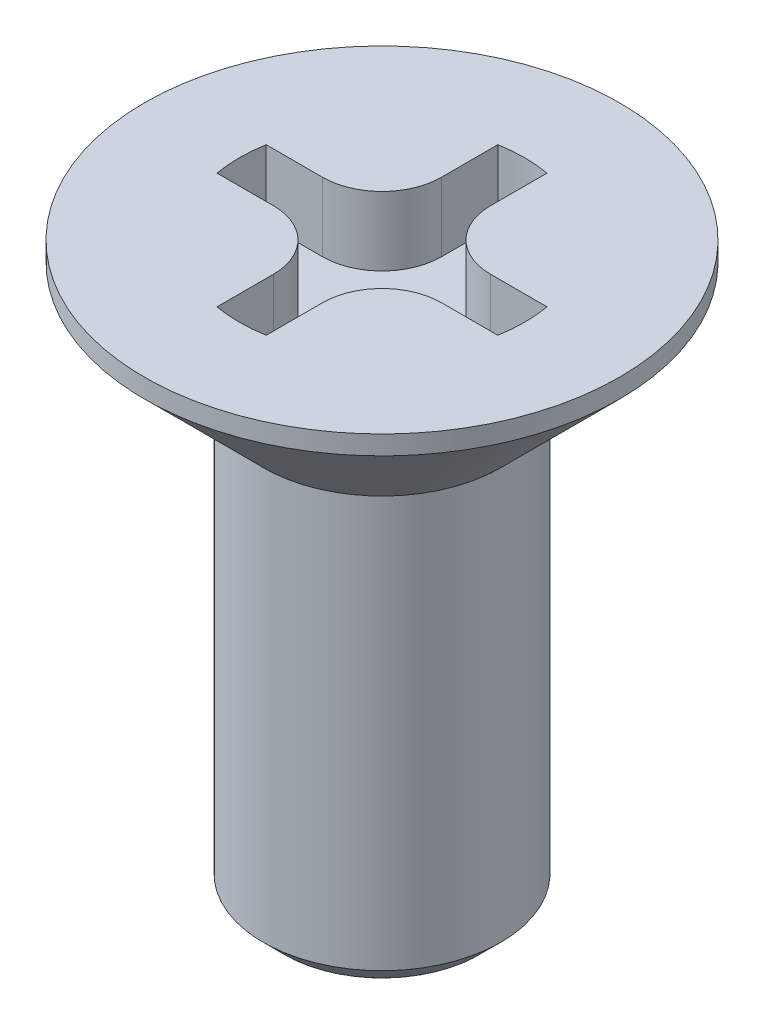
ISO-10303-21;
HEADER;
FILE_DESCRIPTION(('STEP AP214'),'2;1');
FILE_NAME('part.step','',(''),(''),'','','');
FILE_SCHEMA(('AUTOMOTIVE_DESIGN { 1 0 10303 214 1 1 1 1 }'));
ENDSEC;
DATA;
#1=APPLICATION_CONTEXT('core data for automotive mechanical design processes');
#2=APPLICATION_PROTOCOL_DEFINITION('international standard','automotive_design',2000,#1);
#3=PRODUCT_CONTEXT('',#1,'mechanical');
#4=PRODUCT('Part','Part','',(#3));
#5=PRODUCT_RELATED_PRODUCT_CATEGORY('part','',(#4));
#6=PRODUCT_DEFINITION_FORMATION('','',#4);
#7=PRODUCT_DEFINITION_CONTEXT('part definition',#1,'design');
#8=PRODUCT_DEFINITION('design','',#6,#7);
#9=PRODUCT_DEFINITION_SHAPE('','',#8);
#10=(LENGTH_UNIT() NAMED_UNIT(*) SI_UNIT(.MILLI.,.METRE.));
#11=(NAMED_UNIT(*) PLANE_ANGLE_UNIT() SI_UNIT($,.RADIAN.));
#12=(NAMED_UNIT(*) SI_UNIT($,.STERADIAN.) SOLID_ANGLE_UNIT());
#13=UNCERTAINTY_MEASURE_WITH_UNIT(LENGTH_MEASURE(1.E-05),#10,'distance_accuracy_value','');
#14=(GEOMETRIC_REPRESENTATION_CONTEXT(3) GLOBAL_UNCERTAINTY_ASSIGNED_CONTEXT((#13)) GLOBAL_UNIT_ASSIGNED_CONTEXT((#10,
#11,#12)) REPRESENTATION_CONTEXT('',''));
#15=CARTESIAN_POINT('',(0.,0.,0.));
#16=DIRECTION('',(0.,0.,1.));
#17=DIRECTION('',(1.,0.,0.));
#18=AXIS2_PLACEMENT_3D('',#15,#16,#17);
#19=CARTESIAN_POINT('',(0.,0.725,0.));
#20=DIRECTION('',(0.,-1.,0.));
#21=DIRECTION('',(0.,0.,-1.));
#22=AXIS2_PLACEMENT_3D('',#19,#20,#21);
#23=PLANE('',#22);
#24=CARTESIAN_POINT('',(-0.8838834764832,0.725,0.8838834764832));
#25=DIRECTION('',(0.,1.,0.));
#26=DIRECTION('',(1.,0.,0.));
#27=AXIS2_PLACEMENT_3D('',#24,#25,#26);
#28=CIRCLE('',#27,0.625);
#29=CARTESIAN_POINT('',(-0.2588834764832,0.725,0.8838834764832));
#30=VERTEX_POINT('',#29);
#31=CARTESIAN_POINT('',(-0.8838834764832,0.725,0.2588834764832));
#32=VERTEX_POINT('',#31);
#33=EDGE_CURVE('P0_E11',#30,#32,#28,.T.);
#34=ORIENTED_EDGE('',*,*,#33,.F.);
#35=DIRECTION('',(0.,0.,-1.));
#36=VECTOR('',#35,1.);
#37=CARTESIAN_POINT('',(-0.2588834764832,0.725,1.477490895269));
#38=LINE('',#37,#36);
#39=CARTESIAN_POINT('',(-0.2588834764832,0.725,1.477490895269));
#40=VERTEX_POINT('',#39);
#41=EDGE_CURVE('P0_E42',#40,#30,#38,.T.);
#42=ORIENTED_EDGE('',*,*,#41,.F.);
#43=CARTESIAN_POINT('',(0.,0.725,0.));
#44=DIRECTION('',(0.,-1.,0.));
#45=DIRECTION('',(0.172588984322101,0.,0.984993930179606));
#46=AXIS2_PLACEMENT_3D('',#43,#44,#45);
#47=CIRCLE('',#46,1.5);
#48=CARTESIAN_POINT('',(0.2588834764832,0.725,1.477490895269));
#49=VERTEX_POINT('',#48);
#50=EDGE_CURVE('P0_E304',#49,#40,#47,.T.);
#51=ORIENTED_EDGE('',*,*,#50,.F.);
#52=DIRECTION('',(0.,0.,1.));
#53=VECTOR('',#52,1.);
#54=CARTESIAN_POINT('',(0.2588834764832,0.725,0.8838834764832));
#55=LINE('',#54,#53);
#56=CARTESIAN_POINT('',(0.2588834764832,0.725,0.8838834764832));
#57=VERTEX_POINT('',#56);
#58=EDGE_CURVE('P0_E303',#57,#49,#55,.T.);
#59=ORIENTED_EDGE('',*,*,#58,.F.);
#60=CARTESIAN_POINT('',(0.8838834764832,0.725,0.8838834764832));
#61=DIRECTION('',(0.,1.,0.));
#62=DIRECTION('',(0.,0.,-1.));
#63=AXIS2_PLACEMENT_3D('',#60,#61,#62);
#64=CIRCLE('',#63,0.625);
#65=CARTESIAN_POINT('',(0.8838834764832,0.725,0.2588834764832));
#66=VERTEX_POINT('',#65);
#67=EDGE_CURVE('P0_E241',#66,#57,#64,.T.);
#68=ORIENTED_EDGE('',*,*,#67,.F.);
#69=DIRECTION('',(-1.,0.,0.));
#70=VECTOR('',#69,1.);
#71=CARTESIAN_POINT('',(1.477490895269,0.725,0.2588834764832));
#72=LINE('',#71,#70);
#73=CARTESIAN_POINT('',(1.477490895269,0.725,0.2588834764832));
#74=VERTEX_POINT('',#73);
#75=EDGE_CURVE('P0_E295',#74,#66,#72,.T.);
#76=ORIENTED_EDGE('',*,*,#75,.F.);
#77=CARTESIAN_POINT('',(0.,0.725,0.));
#78=DIRECTION('',(0.,-1.,0.));
#79=DIRECTION('',(0.984993930179606,0.,-0.172588984322101));
#80=AXIS2_PLACEMENT_3D('',#77,#78,#79);
#81=CIRCLE('',#80,1.5);
#82=CARTESIAN_POINT('',(1.477490895269,0.725,-0.2588834764832));
#83=VERTEX_POINT('',#82);
#84=EDGE_CURVE('P0_E217',#83,#74,#81,.T.);
#85=ORIENTED_EDGE('',*,*,#84,.F.);
#86=DIRECTION('',(1.,0.,0.));
#87=VECTOR('',#86,1.);
#88=CARTESIAN_POINT('',(0.8838834764832,0.725,-0.2588834764832));
#89=LINE('',#88,#87);
#90=CARTESIAN_POINT('',(0.8838834764832,0.725,-0.2588834764832));
#91=VERTEX_POINT('',#90);
#92=EDGE_CURVE('P0_E218',#91,#83,#89,.T.);
#93=ORIENTED_EDGE('',*,*,#92,.F.);
#94=CARTESIAN_POINT('',(0.8838834764832,0.725,-0.8838834764832));
#95=DIRECTION('',(0.,1.,0.));
#96=DIRECTION('',(-1.,0.,0.));
#97=AXIS2_PLACEMENT_3D('',#94,#95,#96);
#98=CIRCLE('',#97,0.625);
#99=CARTESIAN_POINT('',(0.2588834764832,0.725,-0.8838834764832));
#100=VERTEX_POINT('',#99);
#101=EDGE_CURVE('P0_E266',#100,#91,#98,.T.);
#102=ORIENTED_EDGE('',*,*,#101,.F.);
#103=DIRECTION('',(0.,0.,1.));
#104=VECTOR('',#103,1.);
#105=CARTESIAN_POINT('',(0.2588834764832,0.725,-1.477490895269));
#106=LINE('',#105,#104);
#107=CARTESIAN_POINT('',(0.2588834764832,0.725,-1.477490895269));
#108=VERTEX_POINT('',#107);
#109=EDGE_CURVE('P0_E287',#108,#100,#106,.T.);
#110=ORIENTED_EDGE('',*,*,#109,.F.);
#111=CARTESIAN_POINT('',(0.,0.725,0.));
#112=DIRECTION('',(0.,-1.,0.));
#113=DIRECTION('',(-0.172588984322101,0.,-0.984993930179606));
#114=AXIS2_PLACEMENT_3D('',#111,#112,#113);
#115=CIRCLE('',#114,1.5);
#116=CARTESIAN_POINT('',(-0.2588834764832,0.725,-1.477490895269));
#117=VERTEX_POINT('',#116);
#118=EDGE_CURVE('P0_E282',#117,#108,#115,.T.);
#119=ORIENTED_EDGE('',*,*,#118,.F.);
#120=DIRECTION('',(0.,0.,-1.));
#121=VECTOR('',#120,1.);
#122=CARTESIAN_POINT('',(-0.2588834764832,0.725,-0.8838834764832));
#123=LINE('',#122,#121);
#124=CARTESIAN_POINT('',(-0.2588834764832,0.725,-0.8838834764832));
#125=VERTEX_POINT('',#124);
#126=EDGE_CURVE('P0_E283',#125,#117,#123,.T.);
#127=ORIENTED_EDGE('',*,*,#126,.F.);
#128=CARTESIAN_POINT('',(-0.8838834764832,0.725,-0.8838834764832));
#129=DIRECTION('',(0.,1.,0.));
#130=DIRECTION('',(0.,0.,1.));
#131=AXIS2_PLACEMENT_3D('',#128,#129,#130);
#132=CIRCLE('',#131,0.625);
#133=CARTESIAN_POINT('',(-0.8838834764832,0.725,-0.2588834764832));
#134=VERTEX_POINT('',#133);
#135=EDGE_CURVE('P0_E177',#134,#125,#132,.T.);
#136=ORIENTED_EDGE('',*,*,#135,.F.);
#137=DIRECTION('',(1.,0.,0.));
#138=VECTOR('',#137,1.);
#139=CARTESIAN_POINT('',(-1.477490895269,0.725,-0.2588834764832));
#140=LINE('',#139,#138);
#141=CARTESIAN_POINT('',(-1.477490895269,0.725,-0.2588834764832));
#142=VERTEX_POINT('',#141);
#143=EDGE_CURVE('P0_E173',#142,#134,#140,.T.);
#144=ORIENTED_EDGE('',*,*,#143,.F.);
#145=CARTESIAN_POINT('',(0.,0.725,0.));
#146=DIRECTION('',(0.,-1.,0.));
#147=DIRECTION('',(-0.984993930179606,0.,0.172588984322101));
#148=AXIS2_PLACEMENT_3D('',#145,#146,#147);
#149=CIRCLE('',#148,1.5);
#150=CARTESIAN_POINT('',(-1.477490895269,0.725,0.2588834764832));
#151=VERTEX_POINT('',#150);
#152=EDGE_CURVE('P0_E265',#151,#142,#149,.T.);
#153=ORIENTED_EDGE('',*,*,#152,.F.);
#154=DIRECTION('',(-1.,0.,0.));
#155=VECTOR('',#154,1.);
#156=CARTESIAN_POINT('',(-0.8838834764832,0.725,0.2588834764832));
#157=LINE('',#156,#155);
#158=EDGE_CURVE('P0_E258',#32,#151,#157,.T.);
#159=ORIENTED_EDGE('',*,*,#158,.F.);
#160=EDGE_LOOP('',(#34,#42,#51,#59,#68,#76,#85,#93,#102,#110,#119,#127,#136,#144,#153,#159));
#161=FACE_BOUND('',#160,.T.);
#162=ADVANCED_FACE('P0_F17',(#161),#23,.F.);
#163=CARTESIAN_POINT('',(-0.8838834764832,0.725,0.8838834764832));
#164=DIRECTION('',(0.,-1.,0.));
#165=DIRECTION('',(1.,0.,0.));
#166=AXIS2_PLACEMENT_3D('',#163,#164,#165);
#167=CYLINDRICAL_SURFACE('',#166,0.625);
#168=DIRECTION('',(0.,1.,0.));
#169=VECTOR('',#168,1.);
#170=CARTESIAN_POINT('',(-0.2588834764832,0.725,0.8838834764832));
#171=LINE('',#170,#169);
#172=CARTESIAN_POINT('',(-0.2588834764832,1.45,0.8838834764832));
#173=VERTEX_POINT('',#172);
#174=EDGE_CURVE('P0_E25',#30,#173,#171,.T.);
#175=ORIENTED_EDGE('',*,*,#174,.F.);
#176=ORIENTED_EDGE('',*,*,#33,.T.);
#177=DIRECTION('',(0.,1.,0.));
#178=VECTOR('',#177,1.);
#179=CARTESIAN_POINT('',(-0.8838834764832,0.725,0.2588834764832));
#180=LINE('',#179,#178);
#181=CARTESIAN_POINT('',(-0.8838834764832,1.45,0.2588834764832));
#182=VERTEX_POINT('',#181);
#183=EDGE_CURVE('P0_E255',#32,#182,#180,.T.);
#184=ORIENTED_EDGE('',*,*,#183,.T.);
#185=CARTESIAN_POINT('',(-0.8838834764832,1.45,0.8838834764832));
#186=DIRECTION('',(0.,1.,0.));
#187=DIRECTION('',(1.,0.,0.));
#188=AXIS2_PLACEMENT_3D('',#185,#186,#187);
#189=CIRCLE('',#188,0.625);
#190=EDGE_CURVE('P0_E250',#173,#182,#189,.T.);
#191=ORIENTED_EDGE('',*,*,#190,.F.);
#192=EDGE_LOOP('',(#175,#176,#184,#191));
#193=FACE_BOUND('',#192,.T.);
#194=ADVANCED_FACE('P0_F394',(#193),#167,.T.);
#195=CARTESIAN_POINT('',(-0.2588834764832,0.725,1.477490895269));
#196=DIRECTION('',(-1.,0.,0.));
#197=DIRECTION('',(0.,0.,1.));
#198=AXIS2_PLACEMENT_3D('',#195,#196,#197);
#199=PLANE('',#198);
#200=DIRECTION('',(0.,1.,0.));
#201=VECTOR('',#200,1.);
#202=CARTESIAN_POINT('',(-0.2588834764832,0.725,1.477490895269));
#203=LINE('',#202,#201);
#204=CARTESIAN_POINT('',(-0.2588834764832,1.45,1.477490895269));
#205=VERTEX_POINT('',#204);
#206=EDGE_CURVE('P0_E307',#40,#205,#203,.T.);
#207=ORIENTED_EDGE('',*,*,#206,.F.);
#208=ORIENTED_EDGE('',*,*,#41,.T.);
#209=ORIENTED_EDGE('',*,*,#174,.T.);
#210=DIRECTION('',(0.,0.,-1.));
#211=VECTOR('',#210,1.);
#212=CARTESIAN_POINT('',(-0.2588834764832,1.45,1.477490895269));
#213=LINE('',#212,#211);
#214=EDGE_CURVE('P0_E240',#205,#173,#213,.T.);
#215=ORIENTED_EDGE('',*,*,#214,.F.);
#216=EDGE_LOOP('',(#207,#208,#209,#215));
#217=FACE_BOUND('',#216,.T.);
#218=ADVANCED_FACE('P0_F396',(#217),#199,.F.);
#219=CARTESIAN_POINT('',(0.,0.725,0.));
#220=DIRECTION('',(0.,-1.,0.));
#221=DIRECTION('',(1.,0.,0.));
#222=AXIS2_PLACEMENT_3D('',#219,#220,#221);
#223=CYLINDRICAL_SURFACE('',#222,1.5);
#224=DIRECTION('',(0.,1.,0.));
#225=VECTOR('',#224,1.);
#226=CARTESIAN_POINT('',(0.2588834764832,0.725,1.477490895269));
#227=LINE('',#226,#225);
#228=CARTESIAN_POINT('',(0.2588834764832,1.45,1.477490895269));
#229=VERTEX_POINT('',#228);
#230=EDGE_CURVE('P0_E308',#49,#229,#227,.T.);
#231=ORIENTED_EDGE('',*,*,#230,.F.);
#232=ORIENTED_EDGE('',*,*,#50,.T.);
#233=ORIENTED_EDGE('',*,*,#206,.T.);
#234=CARTESIAN_POINT('',(0.,1.45,0.));
#235=DIRECTION('',(0.,-1.,0.));
#236=DIRECTION('',(0.172588984322101,0.,0.984993930179606));
#237=AXIS2_PLACEMENT_3D('',#234,#235,#236);
#238=CIRCLE('',#237,1.5);
#239=EDGE_CURVE('P0_E236',#229,#205,#238,.T.);
#240=ORIENTED_EDGE('',*,*,#239,.F.);
#241=EDGE_LOOP('',(#231,#232,#233,#240));
#242=FACE_BOUND('',#241,.T.);
#243=ADVANCED_FACE('P0_F399',(#242),#223,.F.);
#244=CARTESIAN_POINT('',(0.2588834764832,0.725,0.8838834764832));
#245=DIRECTION('',(1.,0.,0.));
#246=DIRECTION('',(0.,1.,0.));
#247=AXIS2_PLACEMENT_3D('',#244,#245,#246);
#248=PLANE('',#247);
#249=DIRECTION('',(0.,1.,0.));
#250=VECTOR('',#249,1.);
#251=CARTESIAN_POINT('',(0.2588834764832,0.725,0.8838834764832));
#252=LINE('',#251,#250);
#253=CARTESIAN_POINT('',(0.2588834764832,1.45,0.8838834764832));
#254=VERTEX_POINT('',#253);
#255=EDGE_CURVE('P0_E245',#57,#254,#252,.T.);
#256=ORIENTED_EDGE('',*,*,#255,.F.);
#257=ORIENTED_EDGE('',*,*,#58,.T.);
#258=ORIENTED_EDGE('',*,*,#230,.T.);
#259=DIRECTION('',(0.,0.,1.));
#260=VECTOR('',#259,1.);
#261=CARTESIAN_POINT('',(0.2588834764832,1.45,0.8838834764832));
#262=LINE('',#261,#260);
#263=EDGE_CURVE('P0_E232',#254,#229,#262,.T.);
#264=ORIENTED_EDGE('',*,*,#263,.F.);
#265=EDGE_LOOP('',(#256,#257,#258,#264));
#266=FACE_BOUND('',#265,.T.);
#267=ADVANCED_FACE('P0_F404',(#266),#248,.F.);
#268=CARTESIAN_POINT('',(0.8838834764832,0.725,0.8838834764832));
#269=DIRECTION('',(0.,-1.,0.));
#270=DIRECTION('',(1.,0.,0.));
#271=AXIS2_PLACEMENT_3D('',#268,#269,#270);
#272=CYLINDRICAL_SURFACE('',#271,0.625);
#273=DIRECTION('',(0.,1.,0.));
#274=VECTOR('',#273,1.);
#275=CARTESIAN_POINT('',(0.8838834764832,0.725,0.2588834764832));
#276=LINE('',#275,#274);
#277=CARTESIAN_POINT('',(0.8838834764832,1.45,0.2588834764832));
#278=VERTEX_POINT('',#277);
#279=EDGE_CURVE('P0_E246',#66,#278,#276,.T.);
#280=ORIENTED_EDGE('',*,*,#279,.F.);
#281=ORIENTED_EDGE('',*,*,#67,.T.);
#282=ORIENTED_EDGE('',*,*,#255,.T.);
#283=CARTESIAN_POINT('',(0.8838834764832,1.45,0.8838834764832));
#284=DIRECTION('',(0.,1.,0.));
#285=DIRECTION('',(0.,0.,-1.));
#286=AXIS2_PLACEMENT_3D('',#283,#284,#285);
#287=CIRCLE('',#286,0.625);
#288=EDGE_CURVE('P0_E231',#278,#254,#287,.T.);
#289=ORIENTED_EDGE('',*,*,#288,.F.);
#290=EDGE_LOOP('',(#280,#281,#282,#289));
#291=FACE_BOUND('',#290,.T.);
#292=ADVANCED_FACE('P0_F407',(#291),#272,.T.);
#293=CARTESIAN_POINT('',(1.477490895269,0.725,0.2588834764832));
#294=DIRECTION('',(0.,0.,1.));
#295=DIRECTION('',(1.,0.,0.));
#296=AXIS2_PLACEMENT_3D('',#293,#294,#295);
#297=PLANE('',#296);
#298=DIRECTION('',(0.,1.,0.));
#299=VECTOR('',#298,1.);
#300=CARTESIAN_POINT('',(1.477490895269,0.725,0.2588834764832));
#301=LINE('',#300,#299);
#302=CARTESIAN_POINT('',(1.477490895269,1.45,0.2588834764832));
#303=VERTEX_POINT('',#302);
#304=EDGE_CURVE('P0_E292',#74,#303,#301,.T.);
#305=ORIENTED_EDGE('',*,*,#304,.F.);
#306=ORIENTED_EDGE('',*,*,#75,.T.);
#307=ORIENTED_EDGE('',*,*,#279,.T.);
#308=DIRECTION('',(-1.,0.,0.));
#309=VECTOR('',#308,1.);
#310=CARTESIAN_POINT('',(1.477490895269,1.45,0.2588834764832));
#311=LINE('',#310,#309);
#312=EDGE_CURVE('P0_E227',#303,#278,#311,.T.);
#313=ORIENTED_EDGE('',*,*,#312,.F.);
#314=EDGE_LOOP('',(#305,#306,#307,#313));
#315=FACE_BOUND('',#314,.T.);
#316=ADVANCED_FACE('P0_F411',(#315),#297,.F.);
#317=CARTESIAN_POINT('',(0.,0.725,0.));
#318=DIRECTION('',(0.,-1.,0.));
#319=DIRECTION('',(1.,0.,0.));
#320=AXIS2_PLACEMENT_3D('',#317,#318,#319);
#321=CYLINDRICAL_SURFACE('',#320,1.5);
#322=DIRECTION('',(0.,1.,0.));
#323=VECTOR('',#322,1.);
#324=CARTESIAN_POINT('',(1.477490895269,0.725,-0.2588834764832));
#325=LINE('',#324,#323);
#326=CARTESIAN_POINT('',(1.477490895269,1.45,-0.2588834764832));
#327=VERTEX_POINT('',#326);
#328=EDGE_CURVE('P0_E214',#83,#327,#325,.T.);
#329=ORIENTED_EDGE('',*,*,#328,.F.);
#330=ORIENTED_EDGE('',*,*,#84,.T.);
#331=ORIENTED_EDGE('',*,*,#304,.T.);
#332=CARTESIAN_POINT('',(0.,1.45,0.));
#333=DIRECTION('',(0.,-1.,0.));
#334=DIRECTION('',(0.984993930179606,0.,-0.172588984322101));
#335=AXIS2_PLACEMENT_3D('',#332,#333,#334);
#336=CIRCLE('',#335,1.5);
#337=EDGE_CURVE('P0_E223',#327,#303,#336,.T.);
#338=ORIENTED_EDGE('',*,*,#337,.F.);
#339=EDGE_LOOP('',(#329,#330,#331,#338));
#340=FACE_BOUND('',#339,.T.);
#341=ADVANCED_FACE('P0_F415',(#340),#321,.F.);
#342=CARTESIAN_POINT('',(0.8838834764832,0.725,-0.2588834764832));
#343=DIRECTION('',(0.,0.,-1.));
#344=DIRECTION('',(0.,-1.,0.));
#345=AXIS2_PLACEMENT_3D('',#342,#343,#344);
#346=PLANE('',#345);
#347=ORIENTED_EDGE('',*,*,#92,.T.);
#348=ORIENTED_EDGE('',*,*,#328,.T.);
#349=DIRECTION('',(1.,0.,0.));
#350=VECTOR('',#349,1.);
#351=CARTESIAN_POINT('',(0.8838834764832,1.45,-0.2588834764832));
#352=LINE('',#351,#350);
#353=CARTESIAN_POINT('',(0.8838834764832,1.45,-0.2588834764832));
#354=VERTEX_POINT('',#353);
#355=EDGE_CURVE('P0_E219',#354,#327,#352,.T.);
#356=ORIENTED_EDGE('',*,*,#355,.F.);
#357=DIRECTION('',(0.,1.,0.));
#358=VECTOR('',#357,1.);
#359=CARTESIAN_POINT('',(0.8838834764832,0.725,-0.2588834764832));
#360=LINE('',#359,#358);
#361=EDGE_CURVE('P0_E270',#91,#354,#360,.T.);
#362=ORIENTED_EDGE('',*,*,#361,.F.);
#363=EDGE_LOOP('',(#347,#348,#356,#362));
#364=FACE_BOUND('',#363,.T.);
#365=ADVANCED_FACE('P0_F417',(#364),#346,.F.);
#366=CARTESIAN_POINT('',(0.8838834764832,0.725,-0.8838834764832));
#367=DIRECTION('',(0.,-1.,0.));
#368=DIRECTION('',(1.,0.,0.));
#369=AXIS2_PLACEMENT_3D('',#366,#367,#368);
#370=CYLINDRICAL_SURFACE('',#369,0.625);
#371=ORIENTED_EDGE('',*,*,#101,.T.);
#372=ORIENTED_EDGE('',*,*,#361,.T.);
#373=CARTESIAN_POINT('',(0.8838834764832,1.45,-0.8838834764832));
#374=DIRECTION('',(0.,-1.,0.));
#375=DIRECTION('',(0.,0.,1.));
#376=AXIS2_PLACEMENT_3D('',#373,#374,#375);
#377=CIRCLE('',#376,0.625);
#378=CARTESIAN_POINT('',(0.2588834764832,1.45,-0.8838834764832));
#379=VERTEX_POINT('',#378);
#380=EDGE_CURVE('P0_E213',#354,#379,#377,.T.);
#381=ORIENTED_EDGE('',*,*,#380,.T.);
#382=DIRECTION('',(0.,1.,0.));
#383=VECTOR('',#382,1.);
#384=CARTESIAN_POINT('',(0.2588834764832,0.725,-0.8838834764832));
#385=LINE('',#384,#383);
#386=EDGE_CURVE('P0_E271',#100,#379,#385,.T.);
#387=ORIENTED_EDGE('',*,*,#386,.F.);
#388=EDGE_LOOP('',(#371,#372,#381,#387));
#389=FACE_BOUND('',#388,.T.);
#390=ADVANCED_FACE('P0_F378',(#389),#370,.T.);
#391=CARTESIAN_POINT('',(0.2588834764832,0.725,-1.477490895269));
#392=DIRECTION('',(1.,0.,0.));
#393=DIRECTION('',(0.,1.,0.));
#394=AXIS2_PLACEMENT_3D('',#391,#392,#393);
#395=PLANE('',#394);
#396=ORIENTED_EDGE('',*,*,#109,.T.);
#397=ORIENTED_EDGE('',*,*,#386,.T.);
#398=DIRECTION('',(0.,0.,1.));
#399=VECTOR('',#398,1.);
#400=CARTESIAN_POINT('',(0.2588834764832,1.45,-1.477490895269));
#401=LINE('',#400,#399);
#402=CARTESIAN_POINT('',(0.2588834764832,1.45,-1.477490895269));
#403=VERTEX_POINT('',#402);
#404=EDGE_CURVE('P0_E209',#403,#379,#401,.T.);
#405=ORIENTED_EDGE('',*,*,#404,.F.);
#406=DIRECTION('',(0.,1.,0.));
#407=VECTOR('',#406,1.);
#408=CARTESIAN_POINT('',(0.2588834764832,0.725,-1.477490895269));
#409=LINE('',#408,#407);
#410=EDGE_CURVE('P0_E284',#108,#403,#409,.T.);
#411=ORIENTED_EDGE('',*,*,#410,.F.);
#412=EDGE_LOOP('',(#396,#397,#405,#411));
#413=FACE_BOUND('',#412,.T.);
#414=ADVANCED_FACE('P0_F372',(#413),#395,.F.);
#415=CARTESIAN_POINT('',(0.,0.725,0.));
#416=DIRECTION('',(0.,-1.,0.));
#417=DIRECTION('',(1.,0.,0.));
#418=AXIS2_PLACEMENT_3D('',#415,#416,#417);
#419=CYLINDRICAL_SURFACE('',#418,1.5);
#420=ORIENTED_EDGE('',*,*,#118,.T.);
#421=ORIENTED_EDGE('',*,*,#410,.T.);
#422=CARTESIAN_POINT('',(0.,1.45,0.));
#423=DIRECTION('',(0.,-1.,0.));
#424=DIRECTION('',(-0.172588984322101,0.,-0.984993930179606));
#425=AXIS2_PLACEMENT_3D('',#422,#423,#424);
#426=CIRCLE('',#425,1.5);
#427=CARTESIAN_POINT('',(-0.2588834764832,1.45,-1.477490895269));
#428=VERTEX_POINT('',#427);
#429=EDGE_CURVE('P0_E205',#428,#403,#426,.T.);
#430=ORIENTED_EDGE('',*,*,#429,.F.);
#431=DIRECTION('',(0.,1.,0.));
#432=VECTOR('',#431,1.);
#433=CARTESIAN_POINT('',(-0.2588834764832,0.725,-1.477490895269));
#434=LINE('',#433,#432);
#435=EDGE_CURVE('P0_E279',#117,#428,#434,.T.);
#436=ORIENTED_EDGE('',*,*,#435,.F.);
#437=EDGE_LOOP('',(#420,#421,#430,#436));
#438=FACE_BOUND('',#437,.T.);
#439=ADVANCED_FACE('P0_F383',(#438),#419,.F.);
#440=CARTESIAN_POINT('',(-0.2588834764832,0.725,-0.8838834764832));
#441=DIRECTION('',(-1.,0.,0.));
#442=DIRECTION('',(0.,0.,1.));
#443=AXIS2_PLACEMENT_3D('',#440,#441,#442);
#444=PLANE('',#443);
#445=ORIENTED_EDGE('',*,*,#126,.T.);
#446=ORIENTED_EDGE('',*,*,#435,.T.);
#447=DIRECTION('',(0.,0.,-1.));
#448=VECTOR('',#447,1.);
#449=CARTESIAN_POINT('',(-0.2588834764832,1.45,-0.8838834764832));
#450=LINE('',#449,#448);
#451=CARTESIAN_POINT('',(-0.2588834764832,1.45,-0.8838834764832));
#452=VERTEX_POINT('',#451);
#453=EDGE_CURVE('P0_E188',#452,#428,#450,.T.);
#454=ORIENTED_EDGE('',*,*,#453,.F.);
#455=DIRECTION('',(0.,1.,0.));
#456=VECTOR('',#455,1.);
#457=CARTESIAN_POINT('',(-0.2588834764832,0.725,-0.8838834764832));
#458=LINE('',#457,#456);
#459=EDGE_CURVE('P0_E183',#125,#452,#458,.T.);
#460=ORIENTED_EDGE('',*,*,#459,.F.);
#461=EDGE_LOOP('',(#445,#446,#454,#460));
#462=FACE_BOUND('',#461,.T.);
#463=ADVANCED_FACE('P0_F385',(#462),#444,.F.);
#464=CARTESIAN_POINT('',(-0.8838834764832,0.725,-0.8838834764832));
#465=DIRECTION('',(0.,-1.,0.));
#466=DIRECTION('',(1.,0.,0.));
#467=AXIS2_PLACEMENT_3D('',#464,#465,#466);
#468=CYLINDRICAL_SURFACE('',#467,0.625);
#469=ORIENTED_EDGE('',*,*,#135,.T.);
#470=ORIENTED_EDGE('',*,*,#459,.T.);
#471=CARTESIAN_POINT('',(-0.8838834764832,1.45,-0.8838834764832));
#472=DIRECTION('',(0.,-1.,0.));
#473=DIRECTION('',(1.,0.,0.));
#474=AXIS2_PLACEMENT_3D('',#471,#472,#473);
#475=CIRCLE('',#474,0.625);
#476=CARTESIAN_POINT('',(-0.8838834764832,1.45,-0.2588834764832));
#477=VERTEX_POINT('',#476);
#478=EDGE_CURVE('P0_E180',#452,#477,#475,.T.);
#479=ORIENTED_EDGE('',*,*,#478,.T.);
#480=DIRECTION('',(0.,1.,0.));
#481=VECTOR('',#480,1.);
#482=CARTESIAN_POINT('',(-0.8838834764832,0.725,-0.2588834764832));
#483=LINE('',#482,#481);
#484=EDGE_CURVE('P0_E166',#134,#477,#483,.T.);
#485=ORIENTED_EDGE('',*,*,#484,.F.);
#486=EDGE_LOOP('',(#469,#470,#479,#485));
#487=FACE_BOUND('',#486,.T.);
#488=ADVANCED_FACE('P0_F181',(#487),#468,.T.);
#489=CARTESIAN_POINT('',(-1.477490895269,0.725,-0.2588834764832));
#490=DIRECTION('',(0.,0.,-1.));
#491=DIRECTION('',(0.,-1.,0.));
#492=AXIS2_PLACEMENT_3D('',#489,#490,#491);
#493=PLANE('',#492);
#494=ORIENTED_EDGE('',*,*,#143,.T.);
#495=ORIENTED_EDGE('',*,*,#484,.T.);
#496=DIRECTION('',(1.,0.,0.));
#497=VECTOR('',#496,1.);
#498=CARTESIAN_POINT('',(-1.477490895269,1.45,-0.2588834764832));
#499=LINE('',#498,#497);
#500=CARTESIAN_POINT('',(-1.477490895269,1.45,-0.2588834764832));
#501=VERTEX_POINT('',#500);
#502=EDGE_CURVE('P0_E171',#501,#477,#499,.T.);
#503=ORIENTED_EDGE('',*,*,#502,.F.);
#504=DIRECTION('',(0.,1.,0.));
#505=VECTOR('',#504,1.);
#506=CARTESIAN_POINT('',(-1.477490895269,0.725,-0.2588834764832));
#507=LINE('',#506,#505);
#508=EDGE_CURVE('P0_E272',#142,#501,#507,.T.);
#509=ORIENTED_EDGE('',*,*,#508,.F.);
#510=EDGE_LOOP('',(#494,#495,#503,#509));
#511=FACE_BOUND('',#510,.T.);
#512=ADVANCED_FACE('P0_F168',(#511),#493,.F.);
#513=CARTESIAN_POINT('',(0.,0.725,0.));
#514=DIRECTION('',(0.,-1.,0.));
#515=DIRECTION('',(1.,0.,0.));
#516=AXIS2_PLACEMENT_3D('',#513,#514,#515);
#517=CYLINDRICAL_SURFACE('',#516,1.5);
#518=DIRECTION('',(0.,1.,0.));
#519=VECTOR('',#518,1.);
#520=CARTESIAN_POINT('',(-1.477490895269,0.725,0.2588834764832));
#521=LINE('',#520,#519);
#522=CARTESIAN_POINT('',(-1.477490895269,1.45,0.2588834764832));
#523=VERTEX_POINT('',#522);
#524=EDGE_CURVE('P0_E262',#151,#523,#521,.T.);
#525=ORIENTED_EDGE('',*,*,#524,.F.);
#526=ORIENTED_EDGE('',*,*,#152,.T.);
#527=ORIENTED_EDGE('',*,*,#508,.T.);
#528=CARTESIAN_POINT('',(0.,1.45,0.));
#529=DIRECTION('',(0.,-1.,0.));
#530=DIRECTION('',(-0.984993930179606,0.,0.172588984322101));
#531=AXIS2_PLACEMENT_3D('',#528,#529,#530);
#532=CIRCLE('',#531,1.5);
#533=EDGE_CURVE('P0_E194',#523,#501,#532,.T.);
#534=ORIENTED_EDGE('',*,*,#533,.F.);
#535=EDGE_LOOP('',(#525,#526,#527,#534));
#536=FACE_BOUND('',#535,.T.);
#537=ADVANCED_FACE('P0_F388',(#536),#517,.F.);
#538=CARTESIAN_POINT('',(-0.8838834764832,0.725,0.2588834764832));
#539=DIRECTION('',(0.,0.,1.));
#540=DIRECTION('',(1.,0.,0.));
#541=AXIS2_PLACEMENT_3D('',#538,#539,#540);
#542=PLANE('',#541);
#543=ORIENTED_EDGE('',*,*,#183,.F.);
#544=ORIENTED_EDGE('',*,*,#158,.T.);
#545=ORIENTED_EDGE('',*,*,#524,.T.);
#546=DIRECTION('',(-1.,0.,0.));
#547=VECTOR('',#546,1.);
#548=CARTESIAN_POINT('',(-0.8838834764832,1.45,0.2588834764832));
#549=LINE('',#548,#547);
#550=EDGE_CURVE('P0_E254',#182,#523,#549,.T.);
#551=ORIENTED_EDGE('',*,*,#550,.F.);
#552=EDGE_LOOP('',(#543,#544,#545,#551));
#553=FACE_BOUND('',#552,.T.);
#554=ADVANCED_FACE('P0_F392',(#553),#542,.F.);
#555=CARTESIAN_POINT('',(0.,1.45,0.));
#556=DIRECTION('',(0.,-1.,0.));
#557=DIRECTION('',(0.,0.,-1.));
#558=AXIS2_PLACEMENT_3D('',#555,#556,#557);
#559=PLANE('',#558);
#560=ORIENTED_EDGE('',*,*,#533,.T.);
#561=ORIENTED_EDGE('',*,*,#502,.T.);
#562=ORIENTED_EDGE('',*,*,#478,.F.);
#563=ORIENTED_EDGE('',*,*,#453,.T.);
#564=ORIENTED_EDGE('',*,*,#429,.T.);
#565=ORIENTED_EDGE('',*,*,#404,.T.);
#566=ORIENTED_EDGE('',*,*,#380,.F.);
#567=ORIENTED_EDGE('',*,*,#355,.T.);
#568=ORIENTED_EDGE('',*,*,#337,.T.);
#569=ORIENTED_EDGE('',*,*,#312,.T.);
#570=ORIENTED_EDGE('',*,*,#288,.T.);
#571=ORIENTED_EDGE('',*,*,#263,.T.);
#572=ORIENTED_EDGE('',*,*,#239,.T.);
#573=ORIENTED_EDGE('',*,*,#214,.T.);
#574=ORIENTED_EDGE('',*,*,#190,.T.);
#575=ORIENTED_EDGE('',*,*,#550,.T.);
#576=EDGE_LOOP('',(#560,#561,#562,#563,#564,#565,#566,#567,#568,#569,#570,#571,#572,#573,#574,#575));
#577=FACE_BOUND('',#576,.T.);
#578=CARTESIAN_POINT('',(0.,1.45,0.));
#579=DIRECTION('',(0.,-1.,0.));
#580=DIRECTION('',(1.,0.,0.));
#581=AXIS2_PLACEMENT_3D('',#578,#579,#580);
#582=CIRCLE('',#581,2.5);
#583=CARTESIAN_POINT('',(2.5,1.45,0.));
#584=VERTEX_POINT('',#583);
#585=EDGE_CURVE('P0_E199',#584,#584,#582,.T.);
#586=ORIENTED_EDGE('',*,*,#585,.F.);
#587=EDGE_LOOP('',(#586));
#588=FACE_BOUND('',#587,.T.);
#589=ADVANCED_FACE('P0_F190',(#577,#588),#559,.F.);
#590=CARTESIAN_POINT('',(0.,1.75,0.));
#591=DIRECTION('',(0.,-1.,0.));
#592=DIRECTION('',(-1.,0.,0.));
#593=AXIS2_PLACEMENT_3D('',#590,#591,#592);
#594=CYLINDRICAL_SURFACE('',#593,2.5);
#595=ORIENTED_EDGE('',*,*,#585,.T.);
#596=EDGE_LOOP('',(#595));
#597=FACE_BOUND('',#596,.T.);
#598=CARTESIAN_POINT('',(0.,1.25,0.));
#599=DIRECTION('',(0.,1.,0.));
#600=DIRECTION('',(1.,0.,0.));
#601=AXIS2_PLACEMENT_3D('',#598,#599,#600);
#602=CIRCLE('',#601,2.5);
#603=CARTESIAN_POINT('',(2.5,1.25,0.));
#604=VERTEX_POINT('',#603);
#605=EDGE_CURVE('P0_E344',#604,#604,#602,.T.);
#606=ORIENTED_EDGE('',*,*,#605,.T.);
#607=EDGE_LOOP('',(#606));
#608=FACE_BOUND('',#607,.T.);
#609=ADVANCED_FACE('P0_F534',(#597,#608),#594,.T.);
#610=CARTESIAN_POINT('',(0.,0.625,0.));
#611=DIRECTION('',(0.,1.,0.));
#612=DIRECTION('',(1.,0.,0.));
#613=AXIS2_PLACEMENT_3D('',#610,#611,#612);
#614=CONICAL_SURFACE('',#613,1.875,0.7853981633973);
#615=ORIENTED_EDGE('',*,*,#605,.F.);
#616=EDGE_LOOP('',(#615));
#617=FACE_BOUND('',#616,.T.);
#618=CARTESIAN_POINT('',(0.,0.,0.));
#619=DIRECTION('',(0.,-1.,0.));
#620=DIRECTION('',(1.,0.,0.));
#621=AXIS2_PLACEMENT_3D('',#618,#619,#620);
#622=CIRCLE('',#621,1.25);
#623=CARTESIAN_POINT('',(1.25,0.,0.));
#624=VERTEX_POINT('',#623);
#625=EDGE_CURVE('P0_E336',#624,#624,#622,.T.);
#626=ORIENTED_EDGE('',*,*,#625,.F.);
#627=EDGE_LOOP('',(#626));
#628=FACE_BOUND('',#627,.T.);
#629=ADVANCED_FACE('P0_F543',(#617,#628),#614,.T.);
#630=CARTESIAN_POINT('',(0.,1.75,0.));
#631=DIRECTION('',(0.,-1.,0.));
#632=DIRECTION('',(-1.,0.,0.));
#633=AXIS2_PLACEMENT_3D('',#630,#631,#632);
#634=CYLINDRICAL_SURFACE('',#633,1.25);
#635=ORIENTED_EDGE('',*,*,#625,.T.);
#636=EDGE_LOOP('',(#635));
#637=FACE_BOUND('',#636,.T.);
#638=CARTESIAN_POINT('',(0.,-4.325,0.));
#639=DIRECTION('',(0.,-1.,0.));
#640=DIRECTION('',(-1.,0.,0.));
#641=AXIS2_PLACEMENT_3D('',#638,#639,#640);
#642=CIRCLE('',#641,1.25);
#643=CARTESIAN_POINT('',(-1.25,-4.325,0.));
#644=VERTEX_POINT('',#643);
#645=EDGE_CURVE('P0_E333',#644,#644,#642,.T.);
#646=ORIENTED_EDGE('',*,*,#645,.F.);
#647=EDGE_LOOP('',(#646));
#648=FACE_BOUND('',#647,.T.);
#649=ADVANCED_FACE('P0_F553',(#637,#648),#634,.T.);
#650=CARTESIAN_POINT('',(0.,-4.4375,0.));
#651=DIRECTION('',(0.,1.,0.));
#652=DIRECTION('',(1.,0.,0.));
#653=AXIS2_PLACEMENT_3D('',#650,#651,#652);
#654=CONICAL_SURFACE('',#653,1.1375,0.7853981633973);
#655=CARTESIAN_POINT('',(0.,-4.55,0.));
#656=DIRECTION('',(0.,1.,0.));
#657=DIRECTION('',(-1.,0.,0.));
#658=AXIS2_PLACEMENT_3D('',#655,#656,#657);
#659=CIRCLE('',#658,1.025);
#660=CARTESIAN_POINT('',(-1.025,-4.55,0.));
#661=VERTEX_POINT('',#660);
#662=EDGE_CURVE('P0_E323',#661,#661,#659,.T.);
#663=ORIENTED_EDGE('',*,*,#662,.T.);
#664=EDGE_LOOP('',(#663));
#665=FACE_BOUND('',#664,.T.);
#666=ORIENTED_EDGE('',*,*,#645,.T.);
#667=EDGE_LOOP('',(#666));
#668=FACE_BOUND('',#667,.T.);
#669=ADVANCED_FACE('P0_F564',(#665,#668),#654,.T.);
#670=CARTESIAN_POINT('',(0.,-4.55,0.));
#671=DIRECTION('',(0.,-1.,0.));
#672=DIRECTION('',(0.,0.,-1.));
#673=AXIS2_PLACEMENT_3D('',#670,#671,#672);
#674=PLANE('',#673);
#675=ORIENTED_EDGE('',*,*,#662,.F.);
#676=EDGE_LOOP('',(#675));
#677=FACE_BOUND('',#676,.T.);
#678=ADVANCED_FACE('P0_F574',(#677),#674,.T.);
#679=CLOSED_SHELL('',(#162,#194,#218,#243,#267,#292,#316,#341,#365,#390,#414,#439,#463,#488,
#512,#537,#554,#589,#609,#629,#649,#669,#678));
#680=MANIFOLD_SOLID_BREP('P0_B1',#679);
#681=CARTESIAN_POINT('',(0.,-4.55,0.));
#682=DIRECTION('',(0.,1.,0.));
#683=DIRECTION('',(-1.,0.,0.));
#684=AXIS2_PLACEMENT_3D('',#681,#682,#683);
#685=CYLINDRICAL_SURFACE('',#684,1.025);
#686=CARTESIAN_POINT('',(0.,0.,0.));
#687=DIRECTION('',(0.,1.,0.));
#688=DIRECTION('',(0.,0.,1.));
#689=AXIS2_PLACEMENT_3D('',#686,#687,#688);
#690=CIRCLE('',#689,1.025);
#691=CARTESIAN_POINT('',(0.,0.,1.025));
#692=VERTEX_POINT('',#691);
#693=EDGE_CURVE('P1_E21',#692,#692,#690,.F.);
#694=ORIENTED_EDGE('',*,*,#693,.T.);
#695=EDGE_LOOP('',(#694));
#696=FACE_BOUND('',#695,.T.);
#697=CARTESIAN_POINT('',(0.,-4.55,0.));
#698=DIRECTION('',(0.,1.,0.));
#699=DIRECTION('',(0.,0.,1.));
#700=AXIS2_PLACEMENT_3D('',#697,#698,#699);
#701=CIRCLE('',#700,1.025);
#702=CARTESIAN_POINT('',(0.,-4.55,1.025));
#703=VERTEX_POINT('',#702);
#704=EDGE_CURVE('P1_E11',#703,#703,#701,.T.);
#705=ORIENTED_EDGE('',*,*,#704,.T.);
#706=EDGE_LOOP('',(#705));
#707=FACE_BOUND('',#706,.T.);
#708=ADVANCED_FACE('P1_F17',(#696,#707),#685,.T.);
#709=CARTESIAN_POINT('',(0.,0.,0.));
#710=DIRECTION('',(0.,1.,0.));
#711=DIRECTION('',(1.,0.,0.));
#712=AXIS2_PLACEMENT_3D('',#709,#710,#711);
#713=PLANE('',#712);
#714=CARTESIAN_POINT('',(-1.25,0.,0.));
#715=CARTESIAN_POINT('',(-1.25,0.,0.248354274519565));
#716=CARTESIAN_POINT('',(-1.15484941563911,0.,0.478354290456362));
#717=CARTESIAN_POINT('',(-1.06001017605389,0.,0.707601717180522));
#718=CARTESIAN_POINT('',(-0.883883476483185,0.,0.883883476483185));
#719=CARTESIAN_POINT('',(-0.708534252031886,0.,1.05938707618712));
#720=CARTESIAN_POINT('',(-0.478354290456362,0.,1.15484941563911));
#721=CARTESIAN_POINT('',(-0.24919041101688,0.,1.24989035621207));
#722=CARTESIAN_POINT('',(0.,0.,1.25));
#723=CARTESIAN_POINT('',(0.248090411158747,0.,1.25010915978796));
#724=CARTESIAN_POINT('',(0.478354290456362,0.,1.15484941563911));
#725=CARTESIAN_POINT('',(0.707601717180586,0.,1.06001017605387));
#726=CARTESIAN_POINT('',(0.883883476483184,0.,0.883883476483185));
#727=CARTESIAN_POINT('',(1.05938707618716,0.,0.708534252031802));
#728=CARTESIAN_POINT('',(1.15484941563911,0.,0.478354290456362));
#729=CARTESIAN_POINT('',(1.25,0.,0.248926036573121));
#730=CARTESIAN_POINT('',(1.25,0.,0.));
#731=B_SPLINE_CURVE_WITH_KNOTS('',2,(#714,#715,#716,#717,#718,#719,#720,#721,#722,#723,#724,
#725,#726,#727,#728,#729,#730),.UNSPECIFIED.,.F.,.F.,(3,2,2,2,2,2,2,2,3),(0.,0.125,0.25,0.375,
0.5,0.625,0.75,0.875,1.),.UNSPECIFIED.);
#732=CARTESIAN_POINT('',(-1.25,0.,0.));
#733=VERTEX_POINT('',#732);
#734=CARTESIAN_POINT('',(1.25,0.,0.));
#735=VERTEX_POINT('',#734);
#736=EDGE_CURVE('P1_E34',#733,#735,#731,.T.);
#737=ORIENTED_EDGE('',*,*,#736,.F.);
#738=CARTESIAN_POINT('',(1.25,0.,0.));
#739=CARTESIAN_POINT('',(1.25,0.,-0.248354274519565));
#740=CARTESIAN_POINT('',(1.15484941563911,0.,-0.478354290456362));
#741=CARTESIAN_POINT('',(1.06001017605389,0.,-0.707601717180522));
#742=CARTESIAN_POINT('',(0.883883476483185,0.,-0.883883476483185));
#743=CARTESIAN_POINT('',(0.708534252031886,0.,-1.05938707618712));
#744=CARTESIAN_POINT('',(0.478354290456362,0.,-1.15484941563911));
#745=CARTESIAN_POINT('',(0.24919041101688,0.,-1.24989035621207));
#746=CARTESIAN_POINT('',(0.,0.,-1.25));
#747=CARTESIAN_POINT('',(-0.248090411158747,0.,-1.25010915978796));
#748=CARTESIAN_POINT('',(-0.478354290456362,0.,-1.15484941563911));
#749=CARTESIAN_POINT('',(-0.707601717180586,0.,-1.06001017605387));
#750=CARTESIAN_POINT('',(-0.883883476483184,0.,-0.883883476483185));
#751=CARTESIAN_POINT('',(-1.05938707618716,0.,-0.708534252031802));
#752=CARTESIAN_POINT('',(-1.15484941563911,0.,-0.478354290456362));
#753=CARTESIAN_POINT('',(-1.25,0.,-0.248926036573121));
#754=CARTESIAN_POINT('',(-1.25,0.,0.));
#755=B_SPLINE_CURVE_WITH_KNOTS('',2,(#738,#739,#740,#741,#742,#743,#744,#745,#746,#747,#748,
#749,#750,#751,#752,#753,#754),.UNSPECIFIED.,.F.,.F.,(3,2,2,2,2,2,2,2,3),(0.,0.125,0.25,0.375,
0.5,0.625,0.75,0.875,1.),.UNSPECIFIED.);
#756=EDGE_CURVE('P1_E31',#735,#733,#755,.T.);
#757=ORIENTED_EDGE('',*,*,#756,.F.);
#758=EDGE_LOOP('',(#737,#757));
#759=FACE_BOUND('',#758,.T.);
#760=ORIENTED_EDGE('',*,*,#693,.F.);
#761=EDGE_LOOP('',(#760));
#762=FACE_BOUND('',#761,.T.);
#763=ADVANCED_FACE('P1_F18',(#759,#762),#713,.F.);
#764=OPEN_SHELL('',(#708,#763));
#765=SHELL_BASED_SURFACE_MODEL('P1_B1',(#764));
#766=ADVANCED_BREP_SHAPE_REPRESENTATION('',(#18,#680),#14);
#767=MANIFOLD_SURFACE_SHAPE_REPRESENTATION('',(#18,#765),#14);
#768=SHAPE_REPRESENTATION('',(#18),#14);
#769=SHAPE_DEFINITION_REPRESENTATION(#9,#768);
#770=SHAPE_REPRESENTATION_RELATIONSHIP('','',#768,#766);
#771=SHAPE_REPRESENTATION_RELATIONSHIP('','',#768,#767);
ENDSEC;
END-ISO-10303-21;
